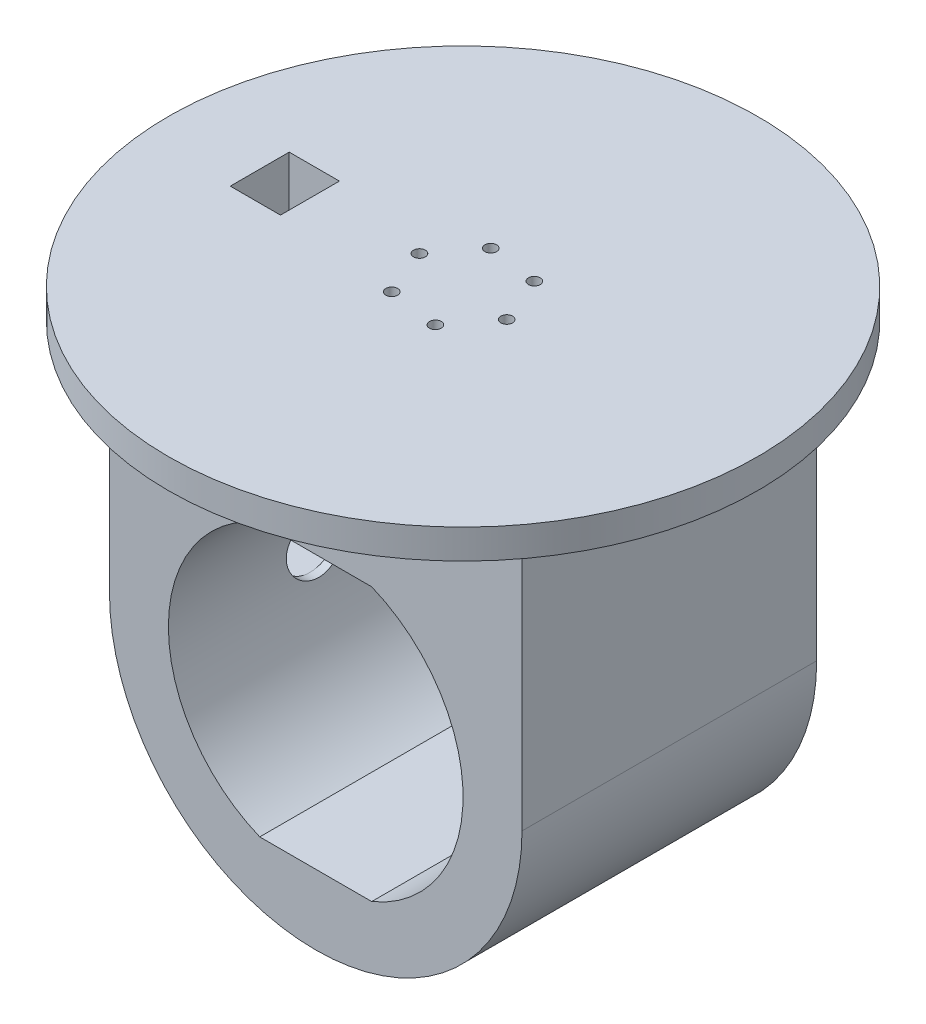
ISO-10303-21;
HEADER;
FILE_DESCRIPTION(('STEP AP214'),'2;1');
FILE_NAME('part.step','',(''),(''),'','','');
FILE_SCHEMA(('AUTOMOTIVE_DESIGN { 1 0 10303 214 1 1 1 1 }'));
ENDSEC;
DATA;
#1=APPLICATION_CONTEXT('core data for automotive mechanical design processes');
#2=APPLICATION_PROTOCOL_DEFINITION('international standard','automotive_design',2000,#1);
#3=PRODUCT_CONTEXT('',#1,'mechanical');
#4=PRODUCT('Part','Part','',(#3));
#5=PRODUCT_RELATED_PRODUCT_CATEGORY('part','',(#4));
#6=PRODUCT_DEFINITION_FORMATION('','',#4);
#7=PRODUCT_DEFINITION_CONTEXT('part definition',#1,'design');
#8=PRODUCT_DEFINITION('design','',#6,#7);
#9=PRODUCT_DEFINITION_SHAPE('','',#8);
#10=(LENGTH_UNIT() NAMED_UNIT(*) SI_UNIT(.MILLI.,.METRE.));
#11=(NAMED_UNIT(*) PLANE_ANGLE_UNIT() SI_UNIT($,.RADIAN.));
#12=(NAMED_UNIT(*) SI_UNIT($,.STERADIAN.) SOLID_ANGLE_UNIT());
#13=UNCERTAINTY_MEASURE_WITH_UNIT(LENGTH_MEASURE(1.E-05),#10,'distance_accuracy_value','');
#14=(GEOMETRIC_REPRESENTATION_CONTEXT(3) GLOBAL_UNCERTAINTY_ASSIGNED_CONTEXT((#13)) GLOBAL_UNIT_ASSIGNED_CONTEXT((#10,
#11,#12)) REPRESENTATION_CONTEXT('',''));
#15=CARTESIAN_POINT('',(0.,0.,0.));
#16=DIRECTION('',(0.,0.,1.));
#17=DIRECTION('',(1.,0.,0.));
#18=AXIS2_PLACEMENT_3D('',#15,#16,#17);
#19=CARTESIAN_POINT('',(-44.,-90.0000000000001,0.));
#20=DIRECTION('',(-1.,0.,0.));
#21=DIRECTION('',(0.,0.,1.));
#22=AXIS2_PLACEMENT_3D('',#19,#20,#21);
#23=CYLINDRICAL_SURFACE('',#22,10.);
#24=CARTESIAN_POINT('',(-50.,-90.,10.));
#25=CARTESIAN_POINT('',(-50.0000028128175,-89.7220222441911,10.0000055381075));
#26=CARTESIAN_POINT('',(-49.9976778384242,-89.4441138564253,9.98840626520698));
#27=CARTESIAN_POINT('',(-49.9884489936652,-88.8902207843583,9.94211201449277));
#28=CARTESIAN_POINT('',(-49.9815443505232,-88.6142364326638,9.90741313883334));
#29=CARTESIAN_POINT('',(-49.963338896907,-88.0660779174844,9.81515482908064));
#30=CARTESIAN_POINT('',(-49.9520350497058,-87.7939065207882,9.75757960309305));
#31=CARTESIAN_POINT('',(-49.9253471525488,-87.2554849887463,9.62002281758797));
#32=CARTESIAN_POINT('',(-49.9099630232179,-86.9892349687006,9.54004082218153));
#33=CARTESIAN_POINT('',(-49.875557789398,-86.4647864030695,9.35837614505516));
#34=CARTESIAN_POINT('',(-49.8565402959035,-86.2065801570967,9.25671499745713));
#35=CARTESIAN_POINT('',(-49.8153808604909,-85.6997103723344,9.03240381691021));
#36=CARTESIAN_POINT('',(-49.7932388901872,-85.4510469202668,8.90975359327451));
#37=CARTESIAN_POINT('',(-49.7464407510478,-84.9649989411219,8.64438617696964));
#38=CARTESIAN_POINT('',(-49.7217851977262,-84.7276116735586,8.50167389377428));
#39=CARTESIAN_POINT('',(-49.6706164211681,-84.2655495230757,8.19711347436054));
#40=CARTESIAN_POINT('',(-49.6441025883656,-84.0408788556414,8.0352590469206));
#41=CARTESIAN_POINT('',(-49.5896179507276,-83.6032029242716,7.69151099293247));
#42=CARTESIAN_POINT('',(-49.5616335002971,-83.3903695808922,7.50940059805498));
#43=CARTESIAN_POINT('',(-49.5052811440085,-82.9807484816167,7.12800276230745));
#44=CARTESIAN_POINT('',(-49.4769132354012,-82.7839608408305,6.92871519823155));
#45=CARTESIAN_POINT('',(-49.4205766446292,-82.4077139465853,6.51425710713592));
#46=CARTESIAN_POINT('',(-49.3926080650955,-82.2282590818363,6.29908258169841));
#47=CARTESIAN_POINT('',(-49.3378715170398,-81.8880259407425,5.85441891068915));
#48=CARTESIAN_POINT('',(-49.3111031320352,-81.7272411543675,5.6249347978562));
#49=CARTESIAN_POINT('',(-49.2592741700544,-81.4239986314088,5.15093110603435));
#50=CARTESIAN_POINT('',(-49.2342317887844,-81.2817252223086,4.90629155557264));
#51=CARTESIAN_POINT('',(-49.1868624133382,-81.0183251715903,4.40562467802123));
#52=CARTESIAN_POINT('',(-49.1645354404014,-80.8971986953756,4.14959726187967));
#53=CARTESIAN_POINT('',(-49.1232596058179,-80.6770219465898,3.62797659181711));
#54=CARTESIAN_POINT('',(-49.1043104848759,-80.5779699793587,3.36238407402867));
#55=CARTESIAN_POINT('',(-49.0703574173401,-80.402708731703,2.82352068665349));
#56=CARTESIAN_POINT('',(-49.0553534119229,-80.3264991106867,2.55024993161985));
#57=CARTESIAN_POINT('',(-49.0299142865412,-80.1983818611765,2.00164556551238));
#58=CARTESIAN_POINT('',(-49.0194218726871,-80.1461688676982,1.72638590991241));
#59=CARTESIAN_POINT('',(-49.0030373167014,-80.0650086694263,1.17232165257597));
#60=CARTESIAN_POINT('',(-48.9971451383128,-80.0360612812634,0.893517078796566));
#61=CARTESIAN_POINT('',(-48.9901389709222,-80.0016704885026,0.334427180817687));
#62=CARTESIAN_POINT('',(-48.9890245531232,-79.9962249746459,0.0541419917619641));
#63=CARTESIAN_POINT('',(-48.9916064960679,-80.0088771960087,-0.505872878529516));
#64=CARTESIAN_POINT('',(-48.9953028164866,-80.0269747338832,-0.785602564401984));
#65=CARTESIAN_POINT('',(-49.0073028247393,-80.0861127871341,-1.33824532124587));
#66=CARTESIAN_POINT('',(-49.015536079802,-80.126802643922,-1.61119753545939));
#67=CARTESIAN_POINT('',(-49.036320161754,-80.2305527381168,-2.1526452365606));
#68=CARTESIAN_POINT('',(-49.0488709385562,-80.293612716011,-2.42114077511176));
#69=CARTESIAN_POINT('',(-49.0779254170084,-80.4416049858215,-2.95176933072517));
#70=CARTESIAN_POINT('',(-49.0944285318041,-80.5265340306979,-3.21390328601519));
#71=CARTESIAN_POINT('',(-49.1309243132211,-80.717665307248,-3.73015471612152));
#72=CARTESIAN_POINT('',(-49.1509182791954,-80.8238754622858,-3.9842691642112));
#73=CARTESIAN_POINT('',(-49.193968635774,-81.0575368948358,-4.48430716692103));
#74=CARTESIAN_POINT('',(-49.2170442207415,-81.1851226973372,-4.73016619671412));
#75=CARTESIAN_POINT('',(-49.2655065055838,-81.4601314834806,-5.21029644603123));
#76=CARTESIAN_POINT('',(-49.2908932898369,-81.6075551914668,-5.44456724200506));
#77=CARTESIAN_POINT('',(-49.3432736408097,-81.9212240262919,-5.89998589786638));
#78=CARTESIAN_POINT('',(-49.3702673358126,-82.0874706567636,-6.1211327072158));
#79=CARTESIAN_POINT('',(-49.4251177358429,-82.4376500692423,-6.54883617417281));
#80=CARTESIAN_POINT('',(-49.452974450993,-82.6215830587539,-6.75539266055053));
#81=CARTESIAN_POINT('',(-49.5092950226298,-83.0093796576902,-7.15614184350201));
#82=CARTESIAN_POINT('',(-49.5377607729691,-83.2135427299913,-7.35004461205845));
#83=CARTESIAN_POINT('',(-49.593999572597,-83.6375375122284,-7.71998887176112));
#84=CARTESIAN_POINT('',(-49.6217726347843,-83.857368930107,-7.89603069568662));
#85=CARTESIAN_POINT('',(-49.6758545011199,-84.3112640623525,-8.22906635011131));
#86=CARTESIAN_POINT('',(-49.7021629769552,-84.5453309434407,-8.38605591894207));
#87=CARTESIAN_POINT('',(-49.7525608218667,-85.0259628032067,-8.67976037836539));
#88=CARTESIAN_POINT('',(-49.776651033654,-85.2725229800764,-8.81648298044947));
#89=CARTESIAN_POINT('',(-49.8219853929275,-85.7769674183032,-9.06894064084388));
#90=CARTESIAN_POINT('',(-49.8432244363277,-86.0348709190359,-9.18463818820071));
#91=CARTESIAN_POINT('',(-49.8822025368672,-86.5597786494062,-9.39386511496707));
#92=CARTESIAN_POINT('',(-49.8999415830674,-86.8267829074848,-9.48739442509111));
#93=CARTESIAN_POINT('',(-49.9314104592983,-87.3679479814492,-9.65154103511389));
#94=CARTESIAN_POINT('',(-49.9451406851622,-87.6421080878484,-9.72216059721068));
#95=CARTESIAN_POINT('',(-49.9681986073688,-88.1956051108862,-9.83992949010135));
#96=CARTESIAN_POINT('',(-49.977526371527,-88.4749419477137,-9.88707918242564));
#97=CARTESIAN_POINT('',(-49.9913926911282,-89.0320190537695,-9.95693197760851));
#98=CARTESIAN_POINT('',(-49.996008784322,-89.3097078057805,-9.98003100307091));
#99=CARTESIAN_POINT('',(-50.0005945404865,-89.866081358938,-10.0029786926444));
#100=CARTESIAN_POINT('',(-50.0005642551857,-90.144766148961,-10.0028276156009));
#101=CARTESIAN_POINT('',(-49.995858262369,-90.7010965420266,-9.9792772862387));
#102=CARTESIAN_POINT('',(-49.991182799381,-90.9787421989982,-9.95587925766857));
#103=CARTESIAN_POINT('',(-49.977318151911,-91.5310023201861,-9.88602545050968));
#104=CARTESIAN_POINT('',(-49.968128976328,-91.8056167903775,-9.83956971738028));
#105=CARTESIAN_POINT('',(-49.9455964444488,-92.3473915665956,-9.72449243317092));
#106=CARTESIAN_POINT('',(-49.9322912853284,-92.6145967541818,-9.6560744846991));
#107=CARTESIAN_POINT('',(-49.9018651328199,-93.1422437227417,-9.49748361094606));
#108=CARTESIAN_POINT('',(-49.8847441697766,-93.4026855574818,-9.40731085866701));
#109=CARTESIAN_POINT('',(-49.8471538847291,-93.9149992195294,-9.20589653570351));
#110=CARTESIAN_POINT('',(-49.8266849889927,-94.1668721329297,-9.09465764693214));
#111=CARTESIAN_POINT('',(-49.7829414314645,-94.6604901228255,-8.85186501396391));
#112=CARTESIAN_POINT('',(-49.75966570737,-94.9022313178217,-8.72030357294717));
#113=CARTESIAN_POINT('',(-49.7106509811734,-95.3766842820937,-8.436150158779));
#114=CARTESIAN_POINT('',(-49.6848860993303,-95.6092554282672,-8.28332783840707));
#115=CARTESIAN_POINT('',(-49.6318230075637,-96.0608470647967,-7.95886129418577));
#116=CARTESIAN_POINT('',(-49.6045241081698,-96.2798613675235,-7.78720857339737));
#117=CARTESIAN_POINT('',(-49.5491477165512,-96.7027949000239,-7.42629320099613));
#118=CARTESIAN_POINT('',(-49.5210701503328,-96.9067126884325,-7.23702887176885));
#119=CARTESIAN_POINT('',(-49.4649210059257,-97.2979891673965,-6.84226248826587));
#120=CARTESIAN_POINT('',(-49.4368494305357,-97.485355102226,-6.63676761297682));
#121=CARTESIAN_POINT('',(-49.3810380611799,-97.8451739168732,-6.20748786867442));
#122=CARTESIAN_POINT('',(-49.353310363521,-98.0173470270382,-5.98346681198443));
#123=CARTESIAN_POINT('',(-49.299449482712,-98.3421448575743,-5.52162011894221));
#124=CARTESIAN_POINT('',(-49.2733157080861,-98.4947768526928,-5.28379966801184));
#125=CARTESIAN_POINT('',(-49.2233833254591,-98.7794895508341,-4.79586898835336));
#126=CARTESIAN_POINT('',(-49.1995851083665,-98.9115668157178,-4.54575671278832));
#127=CARTESIAN_POINT('',(-49.1550271708664,-99.1541533028707,-4.03502160837095));
#128=CARTESIAN_POINT('',(-49.1342674204946,-99.2646627378382,-3.77439888320144));
#129=CARTESIAN_POINT('',(-49.0965031136623,-99.4627428608773,-3.24587758925792));
#130=CARTESIAN_POINT('',(-49.0794794357203,-99.5504308015683,-2.97802434237428));
#131=CARTESIAN_POINT('',(-49.049557707259,-99.7029343431022,-2.43565560808495));
#132=CARTESIAN_POINT('',(-49.0366596491364,-99.7677499860971,-2.16114013295825));
#133=CARTESIAN_POINT('',(-49.0153799031481,-99.8739795618858,-1.60747504571513));
#134=CARTESIAN_POINT('',(-49.0069977203749,-99.9153960590816,-1.32832594486851));
#135=CARTESIAN_POINT('',(-48.9950031602819,-99.9744964341261,-0.767426094073726));
#136=CARTESIAN_POINT('',(-48.9913907153044,-99.9921806486111,-0.485675381085835));
#137=CARTESIAN_POINT('',(-48.9890670526547,-100.00356629258,0.0732067357255149));
#138=CARTESIAN_POINT('',(-48.9902680253775,-99.9976973912584,0.350329115172287));
#139=CARTESIAN_POINT('',(-48.9973383652569,-99.9629888152993,0.903068732035752));
#140=CARTESIAN_POINT('',(-49.0032076724804,-99.9341494355613,1.17868598872977));
#141=CARTESIAN_POINT('',(-49.0194416107497,-99.8537313882406,1.726442666424));
#142=CARTESIAN_POINT('',(-49.0298061805197,-99.8021530306166,1.99858213477846));
#143=CARTESIAN_POINT('',(-49.0547273849827,-99.6766630330014,2.5374651268525));
#144=CARTESIAN_POINT('',(-49.0692840369551,-99.6027513009538,2.80420862832548));
#145=CARTESIAN_POINT('',(-49.1021245177093,-99.4333865029016,3.32975078062101));
#146=CARTESIAN_POINT('',(-49.1203984544624,-99.3379905376576,3.58856846221286));
#147=CARTESIAN_POINT('',(-49.1601842833554,-99.1262196192733,4.09732402283282));
#148=CARTESIAN_POINT('',(-49.1816973528555,-99.009837034863,4.34725863204263));
#149=CARTESIAN_POINT('',(-49.2273493760759,-98.7569725342797,4.83644855707046));
#150=CARTESIAN_POINT('',(-49.2514879794578,-98.6204932988484,5.07570529169817));
#151=CARTESIAN_POINT('',(-49.3017256656574,-98.3283733367216,5.54201196626031));
#152=CARTESIAN_POINT('',(-49.3278248236089,-98.1727318755308,5.76906143780625));
#153=CARTESIAN_POINT('',(-49.3817232731394,-97.8405476830928,6.2132129511787));
#154=CARTESIAN_POINT('',(-49.4095439122405,-97.6636948428115,6.43008053209362));
#155=CARTESIAN_POINT('',(-49.465694806958,-97.292480076708,6.84820368601179));
#156=CARTESIAN_POINT('',(-49.4940250679574,-97.0981179658539,7.04945909398928));
#157=CARTESIAN_POINT('',(-49.5504141712348,-96.6931494087553,7.43504794649766));
#158=CARTESIAN_POINT('',(-49.5784729472321,-96.4825391029284,7.61937734752345));
#159=CARTESIAN_POINT('',(-49.6335340862226,-96.0465335044173,7.96979644712844));
#160=CARTESIAN_POINT('',(-49.6605364731179,-95.8211385465621,8.1358865585465));
#161=CARTESIAN_POINT('',(-49.7130171896248,-95.3545868593253,8.45034780942292));
#162=CARTESIAN_POINT('',(-49.7384761325428,-95.1132873480752,8.59851046393109));
#163=CARTESIAN_POINT('',(-49.7868208088922,-94.6188896299076,8.87388866372604));
#164=CARTESIAN_POINT('',(-49.8097074861751,-94.3657957992669,9.00111190040573));
#165=CARTESIAN_POINT('',(-49.8522536896465,-93.8496466513127,9.23364900819135));
#166=CARTESIAN_POINT('',(-49.8719151676813,-93.5865974783614,9.33897614091421));
#167=CARTESIAN_POINT('',(-49.907462090675,-93.0523688499722,9.52697536111815));
#168=CARTESIAN_POINT('',(-49.9233482630246,-92.7811909720543,9.60965181319042));
#169=CARTESIAN_POINT('',(-49.957617456183,-92.0984043132888,9.78644625447247));
#170=CARTESIAN_POINT('',(-49.97342838053,-91.6829149872146,9.8664196211313));
#171=CARTESIAN_POINT('',(-49.9946173492427,-90.8448969081587,9.97319143913738));
#172=CARTESIAN_POINT('',(-49.9999957261142,-90.4223683799633,9.9999915852206));
#173=CARTESIAN_POINT('',(-50.,-90.,10.));
#174=B_SPLINE_CURVE_WITH_KNOTS('',3,(#24,#25,#26,#27,#28,#29,#30,#31,#32,#33,#34,#35,#36,#37,
#38,#39,#40,#41,#42,#43,#44,#45,#46,#47,#48,#49,#50,#51,#52,#53,#54,#55,#56,#57,#58,#59,#60,#61,
#62,#63,#64,#65,#66,#67,#68,#69,#70,#71,#72,#73,#74,#75,#76,#77,#78,#79,#80,#81,#82,#83,#84,#85,
#86,#87,#88,#89,#90,#91,#92,#93,#94,#95,#96,#97,#98,#99,#100,#101,#102,#103,#104,#105,#106,#107,
#108,#109,#110,#111,#112,#113,#114,#115,#116,#117,#118,#119,#120,#121,#122,#123,#124,#125,#126,
#127,#128,#129,#130,#131,#132,#133,#134,#135,#136,#137,#138,#139,#140,#141,#142,#143,#144,#145,
#146,#147,#148,#149,#150,#151,#152,#153,#154,#155,#156,#157,#158,#159,#160,#161,#162,#163,#164,
#165,#166,#167,#168,#169,#170,#171,#172,#173),.UNSPECIFIED.,.T.,.F.,(4,2,2,2,2,2,2,2,2,2,2,2,2,
2,2,2,2,2,2,2,2,2,2,2,2,2,2,2,2,2,2,2,2,2,2,2,2,2,2,2,2,2,2,2,2,2,2,2,2,2,2,2,2,2,2,2,2,2,2,2,2,
2,2,2,2,2,2,2,2,2,2,2,2,2,4),(0.,0.833562384314091,1.66726546028668,2.50154505692716,
3.33584088430989,4.16931182551707,5.00279033925088,5.83606524274678,6.66961477387656,
7.51314652201104,8.35668432100898,9.20043514940273,10.0438908829918,10.8951899494999,
11.7464956742442,12.5977360217125,13.448963676098,14.2890369198064,15.1291035423628,
15.9690947686019,16.8090789538258,17.6363760447271,18.4636635385808,19.2908282705351,
20.1183015459112,20.9511927835632,21.7841144409473,22.6171026816763,23.4501006966088,
24.2981118345143,25.1461071696511,25.9942918388051,26.8421529444291,27.6915121841459,
28.5408740784488,29.3901520778923,30.2394169946332,31.0744689548642,31.9095116183889,
32.7445103265517,33.5795073884817,34.4069768687223,35.234439768839,36.061797396043,
36.8894691425889,37.7269307633275,38.564771842809,39.4026928136853,40.2402452144657,
41.0909250665882,41.9412873018194,42.7917916225214,43.6422875552718,44.4883234565481,
45.3343577986341,46.1802994025874,47.0262290069552,47.8567974786003,48.6873552874141,
49.5179017751107,50.3484516863023,51.1768196822116,52.0054895034959,52.8340488864429,
53.6626400382729,54.5053049170718,55.3479787018999,56.1908532747241,57.0337087654933,
57.8855779084918,58.7371334442131,59.5881717135778,60.4390458796707,61.7056278569084,
62.9721694650188),.UNSPECIFIED.);
#175=CARTESIAN_POINT('',(-50.,-90.,10.));
#176=VERTEX_POINT('',#175);
#177=EDGE_CURVE('E200',#176,#176,#174,.T.);
#178=ORIENTED_EDGE('',*,*,#177,.F.);
#179=EDGE_LOOP('',(#178));
#180=FACE_BOUND('',#179,.T.);
#181=CARTESIAN_POINT('',(-51.9633661048689,-90.0000000000001,0.));
#182=DIRECTION('',(1.,0.,0.));
#183=DIRECTION('',(0.,0.,-1.));
#184=AXIS2_PLACEMENT_3D('',#181,#182,#183);
#185=CIRCLE('',#184,10.);
#186=CARTESIAN_POINT('',(-51.9633661048689,-90.0000000000001,10.));
#187=VERTEX_POINT('',#186);
#188=CARTESIAN_POINT('',(-51.9633661048689,-90.0000000000001,-9.99999999999999));
#189=VERTEX_POINT('',#188);
#190=EDGE_CURVE('E48',#187,#189,#185,.F.);
#191=ORIENTED_EDGE('',*,*,#190,.T.);
#192=CARTESIAN_POINT('',(-51.9633661048689,-100.,0.));
#193=VERTEX_POINT('',#192);
#194=EDGE_CURVE('E11',#189,#193,#185,.F.);
#195=ORIENTED_EDGE('',*,*,#194,.T.);
#196=EDGE_CURVE('E43',#193,#187,#185,.F.);
#197=ORIENTED_EDGE('',*,*,#196,.T.);
#198=EDGE_LOOP('',(#191,#195,#197));
#199=FACE_BOUND('',#198,.T.);
#200=ADVANCED_FACE('F39',(#180,#199),#23,.F.);
#201=CARTESIAN_POINT('',(23.8740493005626,-43.75,50.));
#202=DIRECTION('',(0.,-1.,0.));
#203=DIRECTION('',(0.,0.,-1.));
#204=AXIS2_PLACEMENT_3D('',#201,#202,#203);
#205=PLANE('',#204);
#206=DIRECTION('',(0.,0.,-1.));
#207=VECTOR('',#206,1.);
#208=CARTESIAN_POINT('',(-18.9983551919633,-43.75,110.));
#209=LINE('',#208,#207);
#210=CARTESIAN_POINT('',(-18.9983551919633,-43.75,-42.3));
#211=VERTEX_POINT('',#210);
#212=CARTESIAN_POINT('',(-18.9983551919633,-43.75,50.));
#213=VERTEX_POINT('',#212);
#214=EDGE_CURVE('E462',#211,#213,#209,.F.);
#215=ORIENTED_EDGE('',*,*,#214,.F.);
#216=DIRECTION('',(1.,0.,0.));
#217=VECTOR('',#216,1.);
#218=CARTESIAN_POINT('',(23.8740493005626,-43.75,-42.3));
#219=LINE('',#218,#217);
#220=CARTESIAN_POINT('',(18.9983551919633,-43.75,-42.3));
#221=VERTEX_POINT('',#220);
#222=EDGE_CURVE('E191',#211,#221,#219,.T.);
#223=ORIENTED_EDGE('',*,*,#222,.T.);
#224=DIRECTION('',(0.,0.,-1.));
#225=VECTOR('',#224,1.);
#226=CARTESIAN_POINT('',(18.9983551919633,-43.75,110.));
#227=LINE('',#226,#225);
#228=CARTESIAN_POINT('',(18.9983551919633,-43.75,50.));
#229=VERTEX_POINT('',#228);
#230=EDGE_CURVE('E250',#229,#221,#227,.T.);
#231=ORIENTED_EDGE('',*,*,#230,.F.);
#232=DIRECTION('',(-1.,0.,0.));
#233=VECTOR('',#232,1.);
#234=CARTESIAN_POINT('',(23.8740493005626,-43.75,50.));
#235=LINE('',#234,#233);
#236=EDGE_CURVE('E197',#229,#213,#235,.T.);
#237=ORIENTED_EDGE('',*,*,#236,.T.);
#238=EDGE_LOOP('',(#215,#223,#231,#237));
#239=FACE_BOUND('',#238,.T.);
#240=ADVANCED_FACE('F265',(#239),#205,.T.);
#241=CARTESIAN_POINT('',(26.3090272437703,-136.25,50.));
#242=DIRECTION('',(0.,1.,0.));
#243=DIRECTION('',(0.,0.,1.));
#244=AXIS2_PLACEMENT_3D('',#241,#242,#243);
#245=PLANE('',#244);
#246=DIRECTION('',(0.,0.,-1.));
#247=VECTOR('',#246,1.);
#248=CARTESIAN_POINT('',(18.9983551919634,-136.25,110.));
#249=LINE('',#248,#247);
#250=CARTESIAN_POINT('',(18.9983551919634,-136.25,-42.3));
#251=VERTEX_POINT('',#250);
#252=CARTESIAN_POINT('',(18.9983551919634,-136.25,50.));
#253=VERTEX_POINT('',#252);
#254=EDGE_CURVE('E457',#251,#253,#249,.F.);
#255=ORIENTED_EDGE('',*,*,#254,.F.);
#256=DIRECTION('',(-1.,0.,0.));
#257=VECTOR('',#256,1.);
#258=CARTESIAN_POINT('',(26.3090272437703,-136.25,-42.3));
#259=LINE('',#258,#257);
#260=CARTESIAN_POINT('',(-18.9983551919634,-136.25,-42.3));
#261=VERTEX_POINT('',#260);
#262=EDGE_CURVE('E460',#251,#261,#259,.T.);
#263=ORIENTED_EDGE('',*,*,#262,.T.);
#264=DIRECTION('',(0.,0.,-1.));
#265=VECTOR('',#264,1.);
#266=CARTESIAN_POINT('',(-18.9983551919634,-136.25,110.));
#267=LINE('',#266,#265);
#268=CARTESIAN_POINT('',(-18.9983551919634,-136.25,50.));
#269=VERTEX_POINT('',#268);
#270=EDGE_CURVE('E459',#269,#261,#267,.T.);
#271=ORIENTED_EDGE('',*,*,#270,.F.);
#272=DIRECTION('',(1.,0.,0.));
#273=VECTOR('',#272,1.);
#274=CARTESIAN_POINT('',(26.3090272437703,-136.25,50.));
#275=LINE('',#274,#273);
#276=EDGE_CURVE('E194',#269,#253,#275,.T.);
#277=ORIENTED_EDGE('',*,*,#276,.T.);
#278=EDGE_LOOP('',(#255,#263,#271,#277));
#279=FACE_BOUND('',#278,.T.);
#280=ADVANCED_FACE('F272',(#279),#245,.T.);
#281=CARTESIAN_POINT('',(0.,10.,0.));
#282=DIRECTION('',(0.,-1.,0.));
#283=DIRECTION('',(0.,0.,-1.));
#284=AXIS2_PLACEMENT_3D('',#281,#282,#283);
#285=CYLINDRICAL_SURFACE('',#284,100.);
#286=CARTESIAN_POINT('',(0.,10.,0.));
#287=DIRECTION('',(0.,1.,0.));
#288=DIRECTION('',(0.,0.,1.));
#289=AXIS2_PLACEMENT_3D('',#286,#287,#288);
#290=CIRCLE('',#289,100.);
#291=CARTESIAN_POINT('',(0.,10.,100.));
#292=VERTEX_POINT('',#291);
#293=EDGE_CURVE('E228',#292,#292,#290,.T.);
#294=ORIENTED_EDGE('',*,*,#293,.F.);
#295=EDGE_LOOP('',(#294));
#296=FACE_BOUND('',#295,.T.);
#297=CARTESIAN_POINT('',(0.,0.,0.));
#298=DIRECTION('',(0.,1.,0.));
#299=DIRECTION('',(0.,0.,1.));
#300=AXIS2_PLACEMENT_3D('',#297,#298,#299);
#301=CIRCLE('',#300,100.);
#302=CARTESIAN_POINT('',(0.,0.,100.));
#303=VERTEX_POINT('',#302);
#304=EDGE_CURVE('E222',#303,#303,#301,.T.);
#305=ORIENTED_EDGE('',*,*,#304,.T.);
#306=EDGE_LOOP('',(#305));
#307=FACE_BOUND('',#306,.T.);
#308=ADVANCED_FACE('F276',(#296,#307),#285,.T.);
#309=CARTESIAN_POINT('',(0.,10.,0.));
#310=DIRECTION('',(0.,1.,0.));
#311=DIRECTION('',(0.,0.,1.));
#312=AXIS2_PLACEMENT_3D('',#309,#310,#311);
#313=PLANE('',#312);
#314=CARTESIAN_POINT('',(-6.55830565186419,10.,-15.9546584725818));
#315=DIRECTION('',(0.,1.,0.));
#316=DIRECTION('',(0.,0.,1.));
#317=AXIS2_PLACEMENT_3D('',#314,#315,#316);
#318=CIRCLE('',#317,2.);
#319=CARTESIAN_POINT('',(-6.55830565186419,10.,-13.9546584725818));
#320=VERTEX_POINT('',#319);
#321=EDGE_CURVE('E375',#320,#320,#318,.T.);
#322=ORIENTED_EDGE('',*,*,#321,.F.);
#323=EDGE_LOOP('',(#322));
#324=FACE_BOUND('',#323,.T.);
#325=CARTESIAN_POINT('',(-17.0962923718926,10.,-2.29766993599341));
#326=DIRECTION('',(0.,1.,0.));
#327=DIRECTION('',(0.,0.,1.));
#328=AXIS2_PLACEMENT_3D('',#325,#326,#327);
#329=CIRCLE('',#328,2.);
#330=CARTESIAN_POINT('',(-17.0962923718926,10.,-0.29766993599341));
#331=VERTEX_POINT('',#330);
#332=EDGE_CURVE('E369',#331,#331,#329,.T.);
#333=ORIENTED_EDGE('',*,*,#332,.F.);
#334=EDGE_LOOP('',(#333));
#335=FACE_BOUND('',#334,.T.);
#336=CARTESIAN_POINT('',(-10.5379867200283,10.,13.6569885365884));
#337=DIRECTION('',(0.,1.,0.));
#338=DIRECTION('',(0.,0.,1.));
#339=AXIS2_PLACEMENT_3D('',#336,#337,#338);
#340=CIRCLE('',#339,2.);
#341=CARTESIAN_POINT('',(-10.5379867200283,10.,15.6569885365884));
#342=VERTEX_POINT('',#341);
#343=EDGE_CURVE('E363',#342,#342,#340,.T.);
#344=ORIENTED_EDGE('',*,*,#343,.F.);
#345=EDGE_LOOP('',(#344));
#346=FACE_BOUND('',#345,.T.);
#347=CARTESIAN_POINT('',(6.5583056518643,10.,15.9546584725818));
#348=DIRECTION('',(0.,1.,0.));
#349=DIRECTION('',(0.,0.,1.));
#350=AXIS2_PLACEMENT_3D('',#347,#348,#349);
#351=CIRCLE('',#350,2.);
#352=CARTESIAN_POINT('',(6.5583056518643,10.,17.9546584725818));
#353=VERTEX_POINT('',#352);
#354=EDGE_CURVE('E355',#353,#353,#351,.T.);
#355=ORIENTED_EDGE('',*,*,#354,.F.);
#356=EDGE_LOOP('',(#355));
#357=FACE_BOUND('',#356,.T.);
#358=CARTESIAN_POINT('',(17.0962923718926,10.,2.29766993599329));
#359=DIRECTION('',(0.,1.,0.));
#360=DIRECTION('',(0.,0.,1.));
#361=AXIS2_PLACEMENT_3D('',#358,#359,#360);
#362=CIRCLE('',#361,2.);
#363=CARTESIAN_POINT('',(17.0962923718926,10.,4.29766993599329));
#364=VERTEX_POINT('',#363);
#365=EDGE_CURVE('E350',#364,#364,#362,.T.);
#366=ORIENTED_EDGE('',*,*,#365,.F.);
#367=EDGE_LOOP('',(#366));
#368=FACE_BOUND('',#367,.T.);
#369=CARTESIAN_POINT('',(10.5379867200282,10.,-13.6569885365885));
#370=DIRECTION('',(0.,1.,0.));
#371=DIRECTION('',(0.,0.,1.));
#372=AXIS2_PLACEMENT_3D('',#369,#370,#371);
#373=CIRCLE('',#372,2.);
#374=CARTESIAN_POINT('',(10.5379867200282,10.,-11.6569885365885));
#375=VERTEX_POINT('',#374);
#376=EDGE_CURVE('E352',#375,#375,#373,.T.);
#377=ORIENTED_EDGE('',*,*,#376,.F.);
#378=EDGE_LOOP('',(#377));
#379=FACE_BOUND('',#378,.T.);
#380=DIRECTION('',(0.,0.,1.));
#381=VECTOR('',#380,1.);
#382=CARTESIAN_POINT('',(-69.,10.,-9.99999999999999));
#383=LINE('',#382,#381);
#384=CARTESIAN_POINT('',(-69.,10.,-9.99999999999999));
#385=VERTEX_POINT('',#384);
#386=CARTESIAN_POINT('',(-69.,10.,10.));
#387=VERTEX_POINT('',#386);
#388=EDGE_CURVE('E158',#385,#387,#383,.T.);
#389=ORIENTED_EDGE('',*,*,#388,.F.);
#390=DIRECTION('',(-1.,0.,0.));
#391=VECTOR('',#390,1.);
#392=CARTESIAN_POINT('',(-69.,10.,-9.99999999999999));
#393=LINE('',#392,#391);
#394=CARTESIAN_POINT('',(-51.9633661048689,10.,-9.99999999999999));
#395=VERTEX_POINT('',#394);
#396=EDGE_CURVE('E154',#395,#385,#393,.T.);
#397=ORIENTED_EDGE('',*,*,#396,.F.);
#398=DIRECTION('',(0.,0.,-1.));
#399=VECTOR('',#398,1.);
#400=CARTESIAN_POINT('',(-51.9633661048689,10.,-9.99999999999999));
#401=LINE('',#400,#399);
#402=CARTESIAN_POINT('',(-51.9633661048689,10.,10.));
#403=VERTEX_POINT('',#402);
#404=EDGE_CURVE('E178',#403,#395,#401,.T.);
#405=ORIENTED_EDGE('',*,*,#404,.F.);
#406=DIRECTION('',(1.,0.,0.));
#407=VECTOR('',#406,1.);
#408=CARTESIAN_POINT('',(-69.,10.,10.));
#409=LINE('',#408,#407);
#410=EDGE_CURVE('E175',#387,#403,#409,.T.);
#411=ORIENTED_EDGE('',*,*,#410,.F.);
#412=EDGE_LOOP('',(#389,#397,#405,#411));
#413=FACE_BOUND('',#412,.T.);
#414=ORIENTED_EDGE('',*,*,#293,.T.);
#415=EDGE_LOOP('',(#414));
#416=FACE_BOUND('',#415,.T.);
#417=ADVANCED_FACE('F386',(#324,#335,#346,#357,#368,#379,#413,#416),#313,.T.);
#418=CARTESIAN_POINT('',(0.,0.,0.));
#419=DIRECTION('',(0.,1.,0.));
#420=DIRECTION('',(0.,0.,1.));
#421=AXIS2_PLACEMENT_3D('',#418,#419,#420);
#422=PLANE('',#421);
#423=DIRECTION('',(1.,0.,0.));
#424=VECTOR('',#423,1.);
#425=CARTESIAN_POINT('',(-70.,0.,50.));
#426=LINE('',#425,#424);
#427=CARTESIAN_POINT('',(-70.,0.,50.));
#428=VERTEX_POINT('',#427);
#429=CARTESIAN_POINT('',(70.,0.,50.));
#430=VERTEX_POINT('',#429);
#431=EDGE_CURVE('E216',#428,#430,#426,.T.);
#432=ORIENTED_EDGE('',*,*,#431,.T.);
#433=DIRECTION('',(0.,0.,-1.));
#434=VECTOR('',#433,1.);
#435=CARTESIAN_POINT('',(70.,0.,50.));
#436=LINE('',#435,#434);
#437=CARTESIAN_POINT('',(70.,0.,-50.));
#438=VERTEX_POINT('',#437);
#439=EDGE_CURVE('E207',#430,#438,#436,.T.);
#440=ORIENTED_EDGE('',*,*,#439,.T.);
#441=DIRECTION('',(-1.,0.,0.));
#442=VECTOR('',#441,1.);
#443=CARTESIAN_POINT('',(-70.,0.,-50.));
#444=LINE('',#443,#442);
#445=CARTESIAN_POINT('',(-70.,0.,-50.));
#446=VERTEX_POINT('',#445);
#447=EDGE_CURVE('E210',#438,#446,#444,.T.);
#448=ORIENTED_EDGE('',*,*,#447,.T.);
#449=DIRECTION('',(0.,0.,1.));
#450=VECTOR('',#449,1.);
#451=CARTESIAN_POINT('',(-70.,0.,50.));
#452=LINE('',#451,#450);
#453=EDGE_CURVE('E213',#446,#428,#452,.T.);
#454=ORIENTED_EDGE('',*,*,#453,.T.);
#455=EDGE_LOOP('',(#432,#440,#448,#454));
#456=FACE_BOUND('',#455,.T.);
#457=ORIENTED_EDGE('',*,*,#304,.F.);
#458=EDGE_LOOP('',(#457));
#459=FACE_BOUND('',#458,.T.);
#460=ADVANCED_FACE('F389',(#456,#459),#422,.F.);
#461=CARTESIAN_POINT('',(70.,-160.,50.));
#462=DIRECTION('',(1.,0.,0.));
#463=DIRECTION('',(0.,0.,-1.));
#464=AXIS2_PLACEMENT_3D('',#461,#462,#463);
#465=PLANE('',#464);
#466=DIRECTION('',(0.,1.,0.));
#467=VECTOR('',#466,1.);
#468=CARTESIAN_POINT('',(70.,-160.,50.));
#469=LINE('',#468,#467);
#470=CARTESIAN_POINT('',(70.,-90.0000000000001,50.));
#471=VERTEX_POINT('',#470);
#472=EDGE_CURVE('E220',#471,#430,#469,.T.);
#473=ORIENTED_EDGE('',*,*,#472,.F.);
#474=DIRECTION('',(0.,0.,-1.));
#475=VECTOR('',#474,1.);
#476=CARTESIAN_POINT('',(70.,-90.0000000000001,50.));
#477=LINE('',#476,#475);
#478=CARTESIAN_POINT('',(70.,-90.0000000000001,-50.));
#479=VERTEX_POINT('',#478);
#480=EDGE_CURVE('E243',#471,#479,#477,.T.);
#481=ORIENTED_EDGE('',*,*,#480,.T.);
#482=DIRECTION('',(0.,1.,0.));
#483=VECTOR('',#482,1.);
#484=CARTESIAN_POINT('',(70.,-160.,-50.));
#485=LINE('',#484,#483);
#486=EDGE_CURVE('E219',#479,#438,#485,.T.);
#487=ORIENTED_EDGE('',*,*,#486,.T.);
#488=ORIENTED_EDGE('',*,*,#439,.F.);
#489=EDGE_LOOP('',(#473,#481,#487,#488));
#490=FACE_BOUND('',#489,.T.);
#491=ADVANCED_FACE('F402',(#490),#465,.T.);
#492=CARTESIAN_POINT('',(-70.,-160.,50.));
#493=DIRECTION('',(0.,0.,1.));
#494=DIRECTION('',(1.,0.,0.));
#495=AXIS2_PLACEMENT_3D('',#492,#493,#494);
#496=PLANE('',#495);
#497=CARTESIAN_POINT('',(0.,-90.,50.));
#498=DIRECTION('',(0.,0.,1.));
#499=DIRECTION('',(1.,0.,0.));
#500=AXIS2_PLACEMENT_3D('',#497,#498,#499);
#501=CIRCLE('',#500,50.);
#502=EDGE_CURVE('E204',#253,#229,#501,.T.);
#503=ORIENTED_EDGE('',*,*,#502,.F.);
#504=ORIENTED_EDGE('',*,*,#276,.F.);
#505=EDGE_CURVE('E205',#213,#269,#501,.T.);
#506=ORIENTED_EDGE('',*,*,#505,.F.);
#507=ORIENTED_EDGE('',*,*,#236,.F.);
#508=EDGE_LOOP('',(#503,#504,#506,#507));
#509=FACE_BOUND('',#508,.T.);
#510=CARTESIAN_POINT('',(0.,-90.0000000000001,50.));
#511=DIRECTION('',(0.,0.,1.));
#512=DIRECTION('',(1.,0.,0.));
#513=AXIS2_PLACEMENT_3D('',#510,#511,#512);
#514=CIRCLE('',#513,70.);
#515=CARTESIAN_POINT('',(-70.,-90.0000000000001,50.));
#516=VERTEX_POINT('',#515);
#517=CARTESIAN_POINT('',(0.,-160.,50.));
#518=VERTEX_POINT('',#517);
#519=EDGE_CURVE('E236',#516,#518,#514,.T.);
#520=ORIENTED_EDGE('',*,*,#519,.T.);
#521=CARTESIAN_POINT('',(0.,-90.0000000000001,50.));
#522=DIRECTION('',(0.,0.,1.));
#523=DIRECTION('',(1.,0.,0.));
#524=AXIS2_PLACEMENT_3D('',#521,#522,#523);
#525=CIRCLE('',#524,70.);
#526=EDGE_CURVE('E248',#518,#471,#525,.T.);
#527=ORIENTED_EDGE('',*,*,#526,.T.);
#528=ORIENTED_EDGE('',*,*,#472,.T.);
#529=ORIENTED_EDGE('',*,*,#431,.F.);
#530=DIRECTION('',(0.,1.,0.));
#531=VECTOR('',#530,1.);
#532=CARTESIAN_POINT('',(-70.,-160.,50.));
#533=LINE('',#532,#531);
#534=EDGE_CURVE('E223',#516,#428,#533,.T.);
#535=ORIENTED_EDGE('',*,*,#534,.F.);
#536=EDGE_LOOP('',(#520,#527,#528,#529,#535));
#537=FACE_BOUND('',#536,.T.);
#538=ADVANCED_FACE('F409',(#509,#537),#496,.T.);
#539=CARTESIAN_POINT('',(-70.,-160.,50.));
#540=DIRECTION('',(-1.,0.,0.));
#541=DIRECTION('',(0.,0.,1.));
#542=AXIS2_PLACEMENT_3D('',#539,#540,#541);
#543=PLANE('',#542);
#544=DIRECTION('',(0.,1.,0.));
#545=VECTOR('',#544,1.);
#546=CARTESIAN_POINT('',(-70.,-160.,-50.));
#547=LINE('',#546,#545);
#548=CARTESIAN_POINT('',(-70.,-90.0000000000001,-50.));
#549=VERTEX_POINT('',#548);
#550=EDGE_CURVE('E225',#549,#446,#547,.T.);
#551=ORIENTED_EDGE('',*,*,#550,.F.);
#552=DIRECTION('',(0.,0.,1.));
#553=VECTOR('',#552,1.);
#554=CARTESIAN_POINT('',(-70.,-90.0000000000001,50.));
#555=LINE('',#554,#553);
#556=EDGE_CURVE('E231',#549,#516,#555,.T.);
#557=ORIENTED_EDGE('',*,*,#556,.T.);
#558=ORIENTED_EDGE('',*,*,#534,.T.);
#559=ORIENTED_EDGE('',*,*,#453,.F.);
#560=EDGE_LOOP('',(#551,#557,#558,#559));
#561=FACE_BOUND('',#560,.T.);
#562=ADVANCED_FACE('F421',(#561),#543,.T.);
#563=CARTESIAN_POINT('',(-70.,-160.,-50.));
#564=DIRECTION('',(0.,0.,-1.));
#565=DIRECTION('',(-1.,0.,0.));
#566=AXIS2_PLACEMENT_3D('',#563,#564,#565);
#567=PLANE('',#566);
#568=CARTESIAN_POINT('',(0.,-90.,-50.));
#569=DIRECTION('',(0.,0.,-1.));
#570=DIRECTION('',(-1.,0.,0.));
#571=AXIS2_PLACEMENT_3D('',#568,#569,#570);
#572=CIRCLE('',#571,50.);
#573=CARTESIAN_POINT('',(-50.,-90.,-50.));
#574=VERTEX_POINT('',#573);
#575=EDGE_CURVE('E201',#574,#574,#572,.T.);
#576=ORIENTED_EDGE('',*,*,#575,.F.);
#577=EDGE_LOOP('',(#576));
#578=FACE_BOUND('',#577,.T.);
#579=ORIENTED_EDGE('',*,*,#486,.F.);
#580=CARTESIAN_POINT('',(0.,-90.0000000000001,-50.));
#581=DIRECTION('',(0.,0.,-1.));
#582=DIRECTION('',(-1.,0.,0.));
#583=AXIS2_PLACEMENT_3D('',#580,#581,#582);
#584=CIRCLE('',#583,70.);
#585=CARTESIAN_POINT('',(0.,-160.,-50.));
#586=VERTEX_POINT('',#585);
#587=EDGE_CURVE('E246',#479,#586,#584,.T.);
#588=ORIENTED_EDGE('',*,*,#587,.T.);
#589=CARTESIAN_POINT('',(0.,-90.0000000000001,-50.));
#590=DIRECTION('',(0.,0.,-1.));
#591=DIRECTION('',(-1.,0.,0.));
#592=AXIS2_PLACEMENT_3D('',#589,#590,#591);
#593=CIRCLE('',#592,70.);
#594=EDGE_CURVE('E241',#586,#549,#593,.T.);
#595=ORIENTED_EDGE('',*,*,#594,.T.);
#596=ORIENTED_EDGE('',*,*,#550,.T.);
#597=ORIENTED_EDGE('',*,*,#447,.F.);
#598=EDGE_LOOP('',(#579,#588,#595,#596,#597));
#599=FACE_BOUND('',#598,.T.);
#600=ADVANCED_FACE('F414',(#578,#599),#567,.T.);
#601=CARTESIAN_POINT('',(0.,-90.0000000000001,50.));
#602=DIRECTION('',(0.,0.,1.));
#603=DIRECTION('',(1.,0.,0.));
#604=AXIS2_PLACEMENT_3D('',#601,#602,#603);
#605=CYLINDRICAL_SURFACE('',#604,70.);
#606=ORIENTED_EDGE('',*,*,#594,.F.);
#607=DIRECTION('',(0.,0.,1.));
#608=VECTOR('',#607,1.);
#609=CARTESIAN_POINT('',(0.,-160.,0.));
#610=LINE('',#609,#608);
#611=EDGE_CURVE('E238',#518,#586,#610,.F.);
#612=ORIENTED_EDGE('',*,*,#611,.F.);
#613=ORIENTED_EDGE('',*,*,#519,.F.);
#614=ORIENTED_EDGE('',*,*,#556,.F.);
#615=EDGE_LOOP('',(#606,#612,#613,#614));
#616=FACE_BOUND('',#615,.T.);
#617=ADVANCED_FACE('F412',(#616),#605,.T.);
#618=CARTESIAN_POINT('',(0.,-90.0000000000001,50.));
#619=DIRECTION('',(0.,0.,-1.));
#620=DIRECTION('',(-1.,0.,0.));
#621=AXIS2_PLACEMENT_3D('',#618,#619,#620);
#622=CYLINDRICAL_SURFACE('',#621,70.);
#623=ORIENTED_EDGE('',*,*,#526,.F.);
#624=ORIENTED_EDGE('',*,*,#611,.T.);
#625=ORIENTED_EDGE('',*,*,#587,.F.);
#626=ORIENTED_EDGE('',*,*,#480,.F.);
#627=EDGE_LOOP('',(#623,#624,#625,#626));
#628=FACE_BOUND('',#627,.T.);
#629=ADVANCED_FACE('F41',(#628),#622,.T.);
#630=CARTESIAN_POINT('',(0.,-90.,110.));
#631=DIRECTION('',(0.,0.,-1.));
#632=DIRECTION('',(-1.,0.,0.));
#633=AXIS2_PLACEMENT_3D('',#630,#631,#632);
#634=CYLINDRICAL_SURFACE('',#633,50.);
#635=CARTESIAN_POINT('',(0.,-90.,-42.3));
#636=DIRECTION('',(0.,0.,-1.));
#637=DIRECTION('',(-1.,0.,0.));
#638=AXIS2_PLACEMENT_3D('',#635,#636,#637);
#639=CIRCLE('',#638,50.);
#640=EDGE_CURVE('E189',#211,#221,#639,.T.);
#641=ORIENTED_EDGE('',*,*,#640,.F.);
#642=ORIENTED_EDGE('',*,*,#214,.T.);
#643=ORIENTED_EDGE('',*,*,#505,.T.);
#644=ORIENTED_EDGE('',*,*,#270,.T.);
#645=EDGE_CURVE('E185',#251,#261,#639,.T.);
#646=ORIENTED_EDGE('',*,*,#645,.F.);
#647=ORIENTED_EDGE('',*,*,#254,.T.);
#648=ORIENTED_EDGE('',*,*,#502,.T.);
#649=ORIENTED_EDGE('',*,*,#230,.T.);
#650=EDGE_LOOP('',(#641,#642,#643,#644,#646,#647,#648,#649));
#651=FACE_BOUND('',#650,.T.);
#652=ORIENTED_EDGE('',*,*,#575,.T.);
#653=EDGE_LOOP('',(#652));
#654=FACE_BOUND('',#653,.T.);
#655=ORIENTED_EDGE('',*,*,#177,.T.);
#656=EDGE_LOOP('',(#655));
#657=FACE_BOUND('',#656,.T.);
#658=ADVANCED_FACE('F259',(#651,#654,#657),#634,.F.);
#659=CARTESIAN_POINT('',(0.,-90.,-42.3));
#660=DIRECTION('',(0.,0.,-1.));
#661=DIRECTION('',(-1.,0.,0.));
#662=AXIS2_PLACEMENT_3D('',#659,#660,#661);
#663=PLANE('',#662);
#664=ORIENTED_EDGE('',*,*,#645,.T.);
#665=ORIENTED_EDGE('',*,*,#262,.F.);
#666=EDGE_LOOP('',(#664,#665));
#667=FACE_BOUND('',#666,.T.);
#668=ADVANCED_FACE('F278',(#667),#663,.T.);
#669=ORIENTED_EDGE('',*,*,#640,.T.);
#670=ORIENTED_EDGE('',*,*,#222,.F.);
#671=EDGE_LOOP('',(#669,#670));
#672=FACE_BOUND('',#671,.T.);
#673=ADVANCED_FACE('F281',(#672),#663,.T.);
#674=CARTESIAN_POINT('',(-51.9633661048689,-100.,-9.99999999999999));
#675=DIRECTION('',(1.,0.,0.));
#676=DIRECTION('',(0.,0.,-1.));
#677=AXIS2_PLACEMENT_3D('',#674,#675,#676);
#678=PLANE('',#677);
#679=DIRECTION('',(0.,1.,0.));
#680=VECTOR('',#679,1.);
#681=CARTESIAN_POINT('',(-51.9633661048689,-100.,-9.99999999999999));
#682=LINE('',#681,#680);
#683=CARTESIAN_POINT('',(-51.9633661048689,-100.,-9.99999999999999));
#684=VERTEX_POINT('',#683);
#685=EDGE_CURVE('E63',#684,#189,#682,.T.);
#686=ORIENTED_EDGE('',*,*,#685,.F.);
#687=DIRECTION('',(0.,0.,-1.));
#688=VECTOR('',#687,1.);
#689=CARTESIAN_POINT('',(-51.9633661048689,-100.,-9.99999999999999));
#690=LINE('',#689,#688);
#691=EDGE_CURVE('E167',#193,#684,#690,.T.);
#692=ORIENTED_EDGE('',*,*,#691,.F.);
#693=ORIENTED_EDGE('',*,*,#194,.F.);
#694=EDGE_LOOP('',(#686,#692,#693));
#695=FACE_BOUND('',#694,.T.);
#696=ADVANCED_FACE('F286',(#695),#678,.F.);
#697=CARTESIAN_POINT('',(-51.9633661048689,-100.,10.));
#698=VERTEX_POINT('',#697);
#699=EDGE_CURVE('E169',#698,#193,#690,.T.);
#700=ORIENTED_EDGE('',*,*,#699,.F.);
#701=DIRECTION('',(0.,1.,0.));
#702=VECTOR('',#701,1.);
#703=CARTESIAN_POINT('',(-51.9633661048689,-100.,10.));
#704=LINE('',#703,#702);
#705=EDGE_CURVE('E165',#698,#187,#704,.T.);
#706=ORIENTED_EDGE('',*,*,#705,.T.);
#707=ORIENTED_EDGE('',*,*,#196,.F.);
#708=EDGE_LOOP('',(#700,#706,#707));
#709=FACE_BOUND('',#708,.T.);
#710=ADVANCED_FACE('F289',(#709),#678,.F.);
#711=EDGE_CURVE('E160',#187,#403,#704,.T.);
#712=ORIENTED_EDGE('',*,*,#711,.T.);
#713=ORIENTED_EDGE('',*,*,#404,.T.);
#714=EDGE_CURVE('E187',#189,#395,#682,.T.);
#715=ORIENTED_EDGE('',*,*,#714,.F.);
#716=ORIENTED_EDGE('',*,*,#190,.F.);
#717=EDGE_LOOP('',(#712,#713,#715,#716));
#718=FACE_BOUND('',#717,.T.);
#719=ADVANCED_FACE('F291',(#718),#678,.F.);
#720=CARTESIAN_POINT('',(-69.,-100.,-9.99999999999999));
#721=DIRECTION('',(0.,0.,-1.));
#722=DIRECTION('',(-1.,0.,0.));
#723=AXIS2_PLACEMENT_3D('',#720,#721,#722);
#724=PLANE('',#723);
#725=DIRECTION('',(0.,1.,0.));
#726=VECTOR('',#725,1.);
#727=CARTESIAN_POINT('',(-69.,-100.,-9.99999999999999));
#728=LINE('',#727,#726);
#729=CARTESIAN_POINT('',(-69.,-100.,-9.99999999999999));
#730=VERTEX_POINT('',#729);
#731=EDGE_CURVE('E183',#730,#385,#728,.T.);
#732=ORIENTED_EDGE('',*,*,#731,.F.);
#733=DIRECTION('',(-1.,0.,0.));
#734=VECTOR('',#733,1.);
#735=CARTESIAN_POINT('',(-69.,-100.,-9.99999999999999));
#736=LINE('',#735,#734);
#737=EDGE_CURVE('E151',#684,#730,#736,.T.);
#738=ORIENTED_EDGE('',*,*,#737,.F.);
#739=ORIENTED_EDGE('',*,*,#685,.T.);
#740=ORIENTED_EDGE('',*,*,#714,.T.);
#741=ORIENTED_EDGE('',*,*,#396,.T.);
#742=EDGE_LOOP('',(#732,#738,#739,#740,#741));
#743=FACE_BOUND('',#742,.T.);
#744=ADVANCED_FACE('F285',(#743),#724,.F.);
#745=CARTESIAN_POINT('',(-69.,-100.,10.));
#746=DIRECTION('',(0.,0.,1.));
#747=DIRECTION('',(1.,0.,0.));
#748=AXIS2_PLACEMENT_3D('',#745,#746,#747);
#749=PLANE('',#748);
#750=DIRECTION('',(0.,1.,0.));
#751=VECTOR('',#750,1.);
#752=CARTESIAN_POINT('',(-69.,-100.,10.));
#753=LINE('',#752,#751);
#754=CARTESIAN_POINT('',(-69.,-100.,10.));
#755=VERTEX_POINT('',#754);
#756=EDGE_CURVE('E55',#755,#387,#753,.T.);
#757=ORIENTED_EDGE('',*,*,#756,.T.);
#758=ORIENTED_EDGE('',*,*,#410,.T.);
#759=ORIENTED_EDGE('',*,*,#711,.F.);
#760=ORIENTED_EDGE('',*,*,#705,.F.);
#761=DIRECTION('',(1.,0.,0.));
#762=VECTOR('',#761,1.);
#763=CARTESIAN_POINT('',(-69.,-100.,10.));
#764=LINE('',#763,#762);
#765=EDGE_CURVE('E150',#755,#698,#764,.T.);
#766=ORIENTED_EDGE('',*,*,#765,.F.);
#767=EDGE_LOOP('',(#757,#758,#759,#760,#766));
#768=FACE_BOUND('',#767,.T.);
#769=ADVANCED_FACE('F162',(#768),#749,.F.);
#770=CARTESIAN_POINT('',(0.,-100.,0.));
#771=DIRECTION('',(0.,1.,0.));
#772=DIRECTION('',(0.,0.,1.));
#773=AXIS2_PLACEMENT_3D('',#770,#771,#772);
#774=PLANE('',#773);
#775=ORIENTED_EDGE('',*,*,#737,.T.);
#776=DIRECTION('',(0.,0.,1.));
#777=VECTOR('',#776,1.);
#778=CARTESIAN_POINT('',(-69.,-100.,-9.99999999999999));
#779=LINE('',#778,#777);
#780=EDGE_CURVE('E147',#730,#755,#779,.T.);
#781=ORIENTED_EDGE('',*,*,#780,.T.);
#782=ORIENTED_EDGE('',*,*,#765,.T.);
#783=ORIENTED_EDGE('',*,*,#699,.T.);
#784=ORIENTED_EDGE('',*,*,#691,.T.);
#785=EDGE_LOOP('',(#775,#781,#782,#783,#784));
#786=FACE_BOUND('',#785,.T.);
#787=ADVANCED_FACE('F148',(#786),#774,.T.);
#788=CARTESIAN_POINT('',(-69.,-90.0000000000001,0.));
#789=DIRECTION('',(-1.,0.,0.));
#790=DIRECTION('',(0.,0.,1.));
#791=AXIS2_PLACEMENT_3D('',#788,#789,#790);
#792=PLANE('',#791);
#793=ORIENTED_EDGE('',*,*,#388,.T.);
#794=ORIENTED_EDGE('',*,*,#756,.F.);
#795=ORIENTED_EDGE('',*,*,#780,.F.);
#796=ORIENTED_EDGE('',*,*,#731,.T.);
#797=EDGE_LOOP('',(#793,#794,#795,#796));
#798=FACE_BOUND('',#797,.T.);
#799=ADVANCED_FACE('F156',(#798),#792,.F.);
#800=CARTESIAN_POINT('',(10.5379867200282,0.,-13.6569885365885));
#801=DIRECTION('',(0.,1.,0.));
#802=DIRECTION('',(0.,0.,1.));
#803=AXIS2_PLACEMENT_3D('',#800,#801,#802);
#804=CYLINDRICAL_SURFACE('',#803,2.);
#805=CARTESIAN_POINT('',(10.5379867200282,0.,-13.6569885365885));
#806=DIRECTION('',(0.,1.,0.));
#807=DIRECTION('',(0.,0.,1.));
#808=AXIS2_PLACEMENT_3D('',#805,#806,#807);
#809=CIRCLE('',#808,2.);
#810=CARTESIAN_POINT('',(10.5379867200282,0.,-11.6569885365885));
#811=VERTEX_POINT('',#810);
#812=EDGE_CURVE('E176',#811,#811,#809,.T.);
#813=ORIENTED_EDGE('',*,*,#812,.F.);
#814=EDGE_LOOP('',(#813));
#815=FACE_BOUND('',#814,.T.);
#816=ORIENTED_EDGE('',*,*,#376,.T.);
#817=EDGE_LOOP('',(#816));
#818=FACE_BOUND('',#817,.T.);
#819=ADVANCED_FACE('F269',(#815,#818),#804,.F.);
#820=CARTESIAN_POINT('',(10.5379867200282,0.,-13.6569885365885));
#821=DIRECTION('',(0.,1.,0.));
#822=DIRECTION('',(0.,0.,1.));
#823=AXIS2_PLACEMENT_3D('',#820,#821,#822);
#824=PLANE('',#823);
#825=ORIENTED_EDGE('',*,*,#812,.T.);
#826=EDGE_LOOP('',(#825));
#827=FACE_BOUND('',#826,.T.);
#828=ADVANCED_FACE('F298',(#827),#824,.T.);
#829=CARTESIAN_POINT('',(17.0962923718926,0.,2.29766993599329));
#830=DIRECTION('',(0.,1.,0.));
#831=DIRECTION('',(0.,0.,1.));
#832=AXIS2_PLACEMENT_3D('',#829,#830,#831);
#833=CYLINDRICAL_SURFACE('',#832,2.);
#834=CARTESIAN_POINT('',(17.0962923718926,0.,2.29766993599329));
#835=DIRECTION('',(0.,1.,0.));
#836=DIRECTION('',(0.,0.,1.));
#837=AXIS2_PLACEMENT_3D('',#834,#835,#836);
#838=CIRCLE('',#837,2.);
#839=CARTESIAN_POINT('',(17.0962923718926,0.,4.29766993599329));
#840=VERTEX_POINT('',#839);
#841=EDGE_CURVE('E347',#840,#840,#838,.T.);
#842=ORIENTED_EDGE('',*,*,#841,.F.);
#843=EDGE_LOOP('',(#842));
#844=FACE_BOUND('',#843,.T.);
#845=ORIENTED_EDGE('',*,*,#365,.T.);
#846=EDGE_LOOP('',(#845));
#847=FACE_BOUND('',#846,.T.);
#848=ADVANCED_FACE('F302',(#844,#847),#833,.F.);
#849=CARTESIAN_POINT('',(17.0962923718926,0.,2.29766993599329));
#850=DIRECTION('',(0.,1.,0.));
#851=DIRECTION('',(0.,0.,1.));
#852=AXIS2_PLACEMENT_3D('',#849,#850,#851);
#853=PLANE('',#852);
#854=ORIENTED_EDGE('',*,*,#841,.T.);
#855=EDGE_LOOP('',(#854));
#856=FACE_BOUND('',#855,.T.);
#857=ADVANCED_FACE('F335',(#856),#853,.T.);
#858=CARTESIAN_POINT('',(6.5583056518643,0.,15.9546584725818));
#859=DIRECTION('',(0.,1.,0.));
#860=DIRECTION('',(0.,0.,1.));
#861=AXIS2_PLACEMENT_3D('',#858,#859,#860);
#862=CYLINDRICAL_SURFACE('',#861,2.);
#863=CARTESIAN_POINT('',(6.5583056518643,0.,15.9546584725818));
#864=DIRECTION('',(0.,1.,0.));
#865=DIRECTION('',(0.,0.,1.));
#866=AXIS2_PLACEMENT_3D('',#863,#864,#865);
#867=CIRCLE('',#866,2.);
#868=CARTESIAN_POINT('',(6.5583056518643,0.,17.9546584725818));
#869=VERTEX_POINT('',#868);
#870=EDGE_CURVE('E360',#869,#869,#867,.T.);
#871=ORIENTED_EDGE('',*,*,#870,.F.);
#872=EDGE_LOOP('',(#871));
#873=FACE_BOUND('',#872,.T.);
#874=ORIENTED_EDGE('',*,*,#354,.T.);
#875=EDGE_LOOP('',(#874));
#876=FACE_BOUND('',#875,.T.);
#877=ADVANCED_FACE('F331',(#873,#876),#862,.F.);
#878=CARTESIAN_POINT('',(6.5583056518643,0.,15.9546584725818));
#879=DIRECTION('',(0.,1.,0.));
#880=DIRECTION('',(0.,0.,1.));
#881=AXIS2_PLACEMENT_3D('',#878,#879,#880);
#882=PLANE('',#881);
#883=ORIENTED_EDGE('',*,*,#870,.T.);
#884=EDGE_LOOP('',(#883));
#885=FACE_BOUND('',#884,.T.);
#886=ADVANCED_FACE('F327',(#885),#882,.T.);
#887=CARTESIAN_POINT('',(-10.5379867200283,0.,13.6569885365884));
#888=DIRECTION('',(0.,1.,0.));
#889=DIRECTION('',(0.,0.,1.));
#890=AXIS2_PLACEMENT_3D('',#887,#888,#889);
#891=CYLINDRICAL_SURFACE('',#890,2.);
#892=CARTESIAN_POINT('',(-10.5379867200283,0.,13.6569885365884));
#893=DIRECTION('',(0.,1.,0.));
#894=DIRECTION('',(0.,0.,1.));
#895=AXIS2_PLACEMENT_3D('',#892,#893,#894);
#896=CIRCLE('',#895,2.);
#897=CARTESIAN_POINT('',(-10.5379867200283,0.,15.6569885365884));
#898=VERTEX_POINT('',#897);
#899=EDGE_CURVE('E366',#898,#898,#896,.T.);
#900=ORIENTED_EDGE('',*,*,#899,.F.);
#901=EDGE_LOOP('',(#900));
#902=FACE_BOUND('',#901,.T.);
#903=ORIENTED_EDGE('',*,*,#343,.T.);
#904=EDGE_LOOP('',(#903));
#905=FACE_BOUND('',#904,.T.);
#906=ADVANCED_FACE('F323',(#902,#905),#891,.F.);
#907=CARTESIAN_POINT('',(-10.5379867200283,0.,13.6569885365884));
#908=DIRECTION('',(0.,1.,0.));
#909=DIRECTION('',(0.,0.,1.));
#910=AXIS2_PLACEMENT_3D('',#907,#908,#909);
#911=PLANE('',#910);
#912=ORIENTED_EDGE('',*,*,#899,.T.);
#913=EDGE_LOOP('',(#912));
#914=FACE_BOUND('',#913,.T.);
#915=ADVANCED_FACE('F319',(#914),#911,.T.);
#916=CARTESIAN_POINT('',(-17.0962923718926,0.,-2.29766993599341));
#917=DIRECTION('',(0.,1.,0.));
#918=DIRECTION('',(0.,0.,1.));
#919=AXIS2_PLACEMENT_3D('',#916,#917,#918);
#920=CYLINDRICAL_SURFACE('',#919,2.);
#921=CARTESIAN_POINT('',(-17.0962923718926,0.,-2.29766993599341));
#922=DIRECTION('',(0.,1.,0.));
#923=DIRECTION('',(0.,0.,1.));
#924=AXIS2_PLACEMENT_3D('',#921,#922,#923);
#925=CIRCLE('',#924,2.);
#926=CARTESIAN_POINT('',(-17.0962923718926,0.,-0.29766993599341));
#927=VERTEX_POINT('',#926);
#928=EDGE_CURVE('E372',#927,#927,#925,.T.);
#929=ORIENTED_EDGE('',*,*,#928,.F.);
#930=EDGE_LOOP('',(#929));
#931=FACE_BOUND('',#930,.T.);
#932=ORIENTED_EDGE('',*,*,#332,.T.);
#933=EDGE_LOOP('',(#932));
#934=FACE_BOUND('',#933,.T.);
#935=ADVANCED_FACE('F315',(#931,#934),#920,.F.);
#936=CARTESIAN_POINT('',(-17.0962923718926,0.,-2.29766993599341));
#937=DIRECTION('',(0.,1.,0.));
#938=DIRECTION('',(0.,0.,1.));
#939=AXIS2_PLACEMENT_3D('',#936,#937,#938);
#940=PLANE('',#939);
#941=ORIENTED_EDGE('',*,*,#928,.T.);
#942=EDGE_LOOP('',(#941));
#943=FACE_BOUND('',#942,.T.);
#944=ADVANCED_FACE('F311',(#943),#940,.T.);
#945=CARTESIAN_POINT('',(-6.55830565186419,0.,-15.9546584725818));
#946=DIRECTION('',(0.,1.,0.));
#947=DIRECTION('',(0.,0.,1.));
#948=AXIS2_PLACEMENT_3D('',#945,#946,#947);
#949=CYLINDRICAL_SURFACE('',#948,2.);
#950=CARTESIAN_POINT('',(-6.55830565186419,0.,-15.9546584725818));
#951=DIRECTION('',(0.,1.,0.));
#952=DIRECTION('',(0.,0.,1.));
#953=AXIS2_PLACEMENT_3D('',#950,#951,#952);
#954=CIRCLE('',#953,2.);
#955=CARTESIAN_POINT('',(-6.55830565186419,0.,-13.9546584725818));
#956=VERTEX_POINT('',#955);
#957=EDGE_CURVE('E378',#956,#956,#954,.T.);
#958=ORIENTED_EDGE('',*,*,#957,.F.);
#959=EDGE_LOOP('',(#958));
#960=FACE_BOUND('',#959,.T.);
#961=ORIENTED_EDGE('',*,*,#321,.T.);
#962=EDGE_LOOP('',(#961));
#963=FACE_BOUND('',#962,.T.);
#964=ADVANCED_FACE('F307',(#960,#963),#949,.F.);
#965=CARTESIAN_POINT('',(-6.55830565186419,0.,-15.9546584725818));
#966=DIRECTION('',(0.,1.,0.));
#967=DIRECTION('',(0.,0.,1.));
#968=AXIS2_PLACEMENT_3D('',#965,#966,#967);
#969=PLANE('',#968);
#970=ORIENTED_EDGE('',*,*,#957,.T.);
#971=EDGE_LOOP('',(#970));
#972=FACE_BOUND('',#971,.T.);
#973=ADVANCED_FACE('F304',(#972),#969,.T.);
#974=CLOSED_SHELL('',(#200,#240,#280,#308,#417,#460,#491,#538,#562,#600,#617,#629,#658,#668,
#673,#696,#710,#719,#744,#769,#787,#799,#819,#828,#848,#857,#877,#886,#906,#915,#935,#944,#964,#973));
#975=MANIFOLD_SOLID_BREP('B2',#974);
#976=ADVANCED_BREP_SHAPE_REPRESENTATION('',(#18,#975),#14);
#977=SHAPE_DEFINITION_REPRESENTATION(#9,#976);
ENDSEC;
END-ISO-10303-21;
